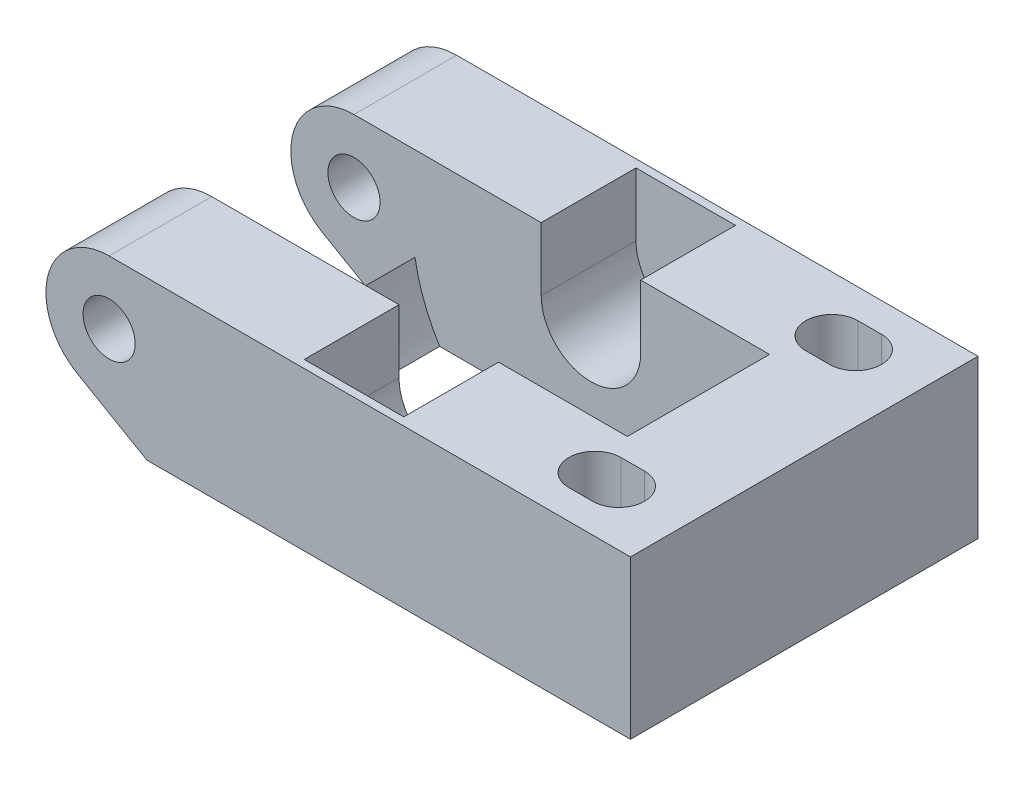
ISO-10303-21;
HEADER;
FILE_DESCRIPTION(('STEP AP214'),'2;1');
FILE_NAME('part.step','',(''),(''),'','','');
FILE_SCHEMA(('AUTOMOTIVE_DESIGN { 1 0 10303 214 1 1 1 1 }'));
ENDSEC;
DATA;
#1=APPLICATION_CONTEXT('core data for automotive mechanical design processes');
#2=APPLICATION_PROTOCOL_DEFINITION('international standard','automotive_design',2000,#1);
#3=PRODUCT_CONTEXT('',#1,'mechanical');
#4=PRODUCT('Part','Part','',(#3));
#5=PRODUCT_RELATED_PRODUCT_CATEGORY('part','',(#4));
#6=PRODUCT_DEFINITION_FORMATION('','',#4);
#7=PRODUCT_DEFINITION_CONTEXT('part definition',#1,'design');
#8=PRODUCT_DEFINITION('design','',#6,#7);
#9=PRODUCT_DEFINITION_SHAPE('','',#8);
#10=(LENGTH_UNIT() NAMED_UNIT(*) SI_UNIT(.MILLI.,.METRE.));
#11=(NAMED_UNIT(*) PLANE_ANGLE_UNIT() SI_UNIT($,.RADIAN.));
#12=(NAMED_UNIT(*) SI_UNIT($,.STERADIAN.) SOLID_ANGLE_UNIT());
#13=UNCERTAINTY_MEASURE_WITH_UNIT(LENGTH_MEASURE(1.E-05),#10,'distance_accuracy_value','');
#14=(GEOMETRIC_REPRESENTATION_CONTEXT(3) GLOBAL_UNCERTAINTY_ASSIGNED_CONTEXT((#13)) GLOBAL_UNIT_ASSIGNED_CONTEXT((#10,
#11,#12)) REPRESENTATION_CONTEXT('',''));
#15=CARTESIAN_POINT('',(0.,0.,0.));
#16=DIRECTION('',(0.,0.,1.));
#17=DIRECTION('',(1.,0.,0.));
#18=AXIS2_PLACEMENT_3D('',#15,#16,#17);
#19=CARTESIAN_POINT('',(-15.,4.,22.));
#20=DIRECTION('',(0.,-1.,0.));
#21=DIRECTION('',(0.,0.,-1.));
#22=AXIS2_PLACEMENT_3D('',#19,#20,#21);
#23=PLANE('',#22);
#24=DIRECTION('',(1.,0.,0.));
#25=VECTOR('',#24,1.);
#26=CARTESIAN_POINT('',(13.75,4.,1.85));
#27=LINE('',#26,#25);
#28=CARTESIAN_POINT('',(12.25,4.,1.85));
#29=VERTEX_POINT('',#28);
#30=CARTESIAN_POINT('',(13.75,4.,1.85));
#31=VERTEX_POINT('',#30);
#32=EDGE_CURVE('E236',#29,#31,#27,.T.);
#33=ORIENTED_EDGE('',*,*,#32,.T.);
#34=CARTESIAN_POINT('',(13.75,4.,3.5));
#35=DIRECTION('',(0.,-1.,0.));
#36=DIRECTION('',(0.,0.,1.));
#37=AXIS2_PLACEMENT_3D('',#34,#35,#36);
#38=CIRCLE('',#37,1.65);
#39=CARTESIAN_POINT('',(13.75,4.,5.15));
#40=VERTEX_POINT('',#39);
#41=EDGE_CURVE('E230',#31,#40,#38,.T.);
#42=ORIENTED_EDGE('',*,*,#41,.T.);
#43=DIRECTION('',(-1.,0.,0.));
#44=VECTOR('',#43,1.);
#45=CARTESIAN_POINT('',(13.75,4.,5.15));
#46=LINE('',#45,#44);
#47=CARTESIAN_POINT('',(12.25,4.,5.15));
#48=VERTEX_POINT('',#47);
#49=EDGE_CURVE('E239',#40,#48,#46,.T.);
#50=ORIENTED_EDGE('',*,*,#49,.T.);
#51=CARTESIAN_POINT('',(12.25,4.,3.5));
#52=DIRECTION('',(0.,-1.,0.));
#53=DIRECTION('',(0.,0.,1.));
#54=AXIS2_PLACEMENT_3D('',#51,#52,#53);
#55=CIRCLE('',#54,1.65);
#56=EDGE_CURVE('E46',#48,#29,#55,.T.);
#57=ORIENTED_EDGE('',*,*,#56,.T.);
#58=EDGE_LOOP('',(#33,#42,#50,#57));
#59=FACE_BOUND('',#58,.T.);
#60=DIRECTION('',(1.,0.,0.));
#61=VECTOR('',#60,1.);
#62=CARTESIAN_POINT('',(13.75,4.,16.85));
#63=LINE('',#62,#61);
#64=CARTESIAN_POINT('',(12.25,4.,16.85));
#65=VERTEX_POINT('',#64);
#66=CARTESIAN_POINT('',(13.75,4.,16.85));
#67=VERTEX_POINT('',#66);
#68=EDGE_CURVE('E274',#65,#67,#63,.T.);
#69=ORIENTED_EDGE('',*,*,#68,.T.);
#70=CARTESIAN_POINT('',(13.75,4.,18.5));
#71=DIRECTION('',(0.,-1.,0.));
#72=DIRECTION('',(0.,0.,-1.));
#73=AXIS2_PLACEMENT_3D('',#70,#71,#72);
#74=CIRCLE('',#73,1.65);
#75=CARTESIAN_POINT('',(13.75,4.,20.15));
#76=VERTEX_POINT('',#75);
#77=EDGE_CURVE('E264',#67,#76,#74,.T.);
#78=ORIENTED_EDGE('',*,*,#77,.T.);
#79=DIRECTION('',(-1.,0.,0.));
#80=VECTOR('',#79,1.);
#81=CARTESIAN_POINT('',(13.75,4.,20.15));
#82=LINE('',#81,#80);
#83=CARTESIAN_POINT('',(12.25,4.,20.15));
#84=VERTEX_POINT('',#83);
#85=EDGE_CURVE('E267',#76,#84,#82,.T.);
#86=ORIENTED_EDGE('',*,*,#85,.T.);
#87=CARTESIAN_POINT('',(12.25,4.,18.5));
#88=DIRECTION('',(0.,-1.,0.));
#89=DIRECTION('',(0.,0.,-1.));
#90=AXIS2_PLACEMENT_3D('',#87,#88,#89);
#91=CIRCLE('',#90,1.65);
#92=EDGE_CURVE('E271',#84,#65,#91,.T.);
#93=ORIENTED_EDGE('',*,*,#92,.T.);
#94=EDGE_LOOP('',(#69,#78,#86,#93));
#95=FACE_BOUND('',#94,.T.);
#96=DIRECTION('',(0.,0.,-1.));
#97=VECTOR('',#96,1.);
#98=CARTESIAN_POINT('',(3.15,4.,22.));
#99=LINE('',#98,#97);
#100=CARTESIAN_POINT('',(3.15,4.,21.5));
#101=VERTEX_POINT('',#100);
#102=CARTESIAN_POINT('',(3.15,4.,15.5));
#103=VERTEX_POINT('',#102);
#104=EDGE_CURVE('E327',#101,#103,#99,.T.);
#105=ORIENTED_EDGE('',*,*,#104,.F.);
#106=DIRECTION('',(-1.,0.,0.));
#107=VECTOR('',#106,1.);
#108=CARTESIAN_POINT('',(-15.,4.,21.5));
#109=LINE('',#108,#107);
#110=CARTESIAN_POINT('',(-3.15,4.,21.5));
#111=VERTEX_POINT('',#110);
#112=EDGE_CURVE('E11',#101,#111,#109,.T.);
#113=ORIENTED_EDGE('',*,*,#112,.T.);
#114=DIRECTION('',(0.,0.,1.));
#115=VECTOR('',#114,1.);
#116=CARTESIAN_POINT('',(-3.15,4.,22.));
#117=LINE('',#116,#115);
#118=CARTESIAN_POINT('',(-3.15,4.,15.5));
#119=VERTEX_POINT('',#118);
#120=EDGE_CURVE('E322',#119,#111,#117,.T.);
#121=ORIENTED_EDGE('',*,*,#120,.F.);
#122=DIRECTION('',(-1.,0.,0.));
#123=VECTOR('',#122,1.);
#124=CARTESIAN_POINT('',(-15.,4.,15.5));
#125=LINE('',#124,#123);
#126=CARTESIAN_POINT('',(-15.,4.,15.5));
#127=VERTEX_POINT('',#126);
#128=EDGE_CURVE('E384',#119,#127,#125,.T.);
#129=ORIENTED_EDGE('',*,*,#128,.T.);
#130=DIRECTION('',(0.,0.,-1.));
#131=VECTOR('',#130,1.);
#132=CARTESIAN_POINT('',(-15.,4.,22.));
#133=LINE('',#132,#131);
#134=CARTESIAN_POINT('',(-15.,4.,22.));
#135=VERTEX_POINT('',#134);
#136=EDGE_CURVE('E429',#135,#127,#133,.T.);
#137=ORIENTED_EDGE('',*,*,#136,.F.);
#138=DIRECTION('',(-1.,0.,0.));
#139=VECTOR('',#138,1.);
#140=CARTESIAN_POINT('',(-15.,4.,22.));
#141=LINE('',#140,#139);
#142=CARTESIAN_POINT('',(18.,4.,22.));
#143=VERTEX_POINT('',#142);
#144=EDGE_CURVE('E398',#143,#135,#141,.T.);
#145=ORIENTED_EDGE('',*,*,#144,.F.);
#146=DIRECTION('',(0.,0.,-1.));
#147=VECTOR('',#146,1.);
#148=CARTESIAN_POINT('',(18.,4.,22.));
#149=LINE('',#148,#147);
#150=CARTESIAN_POINT('',(18.,4.,0.));
#151=VERTEX_POINT('',#150);
#152=EDGE_CURVE('E432',#143,#151,#149,.T.);
#153=ORIENTED_EDGE('',*,*,#152,.T.);
#154=DIRECTION('',(-1.,0.,0.));
#155=VECTOR('',#154,1.);
#156=CARTESIAN_POINT('',(-15.,4.,0.));
#157=LINE('',#156,#155);
#158=CARTESIAN_POINT('',(-15.,4.,0.));
#159=VERTEX_POINT('',#158);
#160=EDGE_CURVE('E410',#151,#159,#157,.T.);
#161=ORIENTED_EDGE('',*,*,#160,.T.);
#162=CARTESIAN_POINT('',(-15.,4.,6.5));
#163=VERTEX_POINT('',#162);
#164=EDGE_CURVE('E428',#163,#159,#133,.T.);
#165=ORIENTED_EDGE('',*,*,#164,.F.);
#166=DIRECTION('',(-1.,0.,0.));
#167=VECTOR('',#166,1.);
#168=CARTESIAN_POINT('',(-15.,4.,6.5));
#169=LINE('',#168,#167);
#170=CARTESIAN_POINT('',(-3.15,4.,6.5));
#171=VERTEX_POINT('',#170);
#172=EDGE_CURVE('E370',#171,#163,#169,.T.);
#173=ORIENTED_EDGE('',*,*,#172,.F.);
#174=CARTESIAN_POINT('',(-3.15,4.,0.499999999999999));
#175=VERTEX_POINT('',#174);
#176=EDGE_CURVE('E319',#175,#171,#117,.T.);
#177=ORIENTED_EDGE('',*,*,#176,.F.);
#178=DIRECTION('',(-1.,0.,0.));
#179=VECTOR('',#178,1.);
#180=CARTESIAN_POINT('',(-15.,4.,0.5));
#181=LINE('',#180,#179);
#182=CARTESIAN_POINT('',(3.15,4.,0.499999999999999));
#183=VERTEX_POINT('',#182);
#184=EDGE_CURVE('E39',#183,#175,#181,.T.);
#185=ORIENTED_EDGE('',*,*,#184,.F.);
#186=CARTESIAN_POINT('',(3.15,4.,6.5));
#187=VERTEX_POINT('',#186);
#188=EDGE_CURVE('E324',#187,#183,#99,.T.);
#189=ORIENTED_EDGE('',*,*,#188,.F.);
#190=CARTESIAN_POINT('',(11.3,4.,6.5));
#191=VERTEX_POINT('',#190);
#192=EDGE_CURVE('E371',#191,#187,#169,.T.);
#193=ORIENTED_EDGE('',*,*,#192,.F.);
#194=DIRECTION('',(0.,0.,-1.));
#195=VECTOR('',#194,1.);
#196=CARTESIAN_POINT('',(11.3,4.,22.));
#197=LINE('',#196,#195);
#198=CARTESIAN_POINT('',(11.3,4.,15.5));
#199=VERTEX_POINT('',#198);
#200=EDGE_CURVE('E446',#199,#191,#197,.T.);
#201=ORIENTED_EDGE('',*,*,#200,.F.);
#202=EDGE_CURVE('E385',#199,#103,#125,.T.);
#203=ORIENTED_EDGE('',*,*,#202,.T.);
#204=EDGE_LOOP('',(#105,#113,#121,#129,#137,#145,#153,#161,#165,#173,#177,#185,#189,#193,#201,#203));
#205=FACE_BOUND('',#204,.T.);
#206=ADVANCED_FACE('F31',(#59,#95,#205),#23,.F.);
#207=CARTESIAN_POINT('',(-15.,0.,15.5));
#208=DIRECTION('',(0.,0.,1.));
#209=DIRECTION('',(1.,0.,0.));
#210=AXIS2_PLACEMENT_3D('',#207,#208,#209);
#211=PLANE('',#210);
#212=CARTESIAN_POINT('',(-15.,0.,15.5));
#213=DIRECTION('',(0.,0.,1.));
#214=DIRECTION('',(1.,0.,0.));
#215=AXIS2_PLACEMENT_3D('',#212,#213,#214);
#216=CIRCLE('',#215,1.65);
#217=CARTESIAN_POINT('',(-13.35,0.,15.5));
#218=VERTEX_POINT('',#217);
#219=EDGE_CURVE('E374',#218,#218,#216,.T.);
#220=ORIENTED_EDGE('',*,*,#219,.T.);
#221=EDGE_LOOP('',(#220));
#222=FACE_BOUND('',#221,.T.);
#223=DIRECTION('',(0.,-1.,0.));
#224=VECTOR('',#223,1.);
#225=CARTESIAN_POINT('',(3.15,0.,15.5));
#226=LINE('',#225,#224);
#227=CARTESIAN_POINT('',(3.15,0.,15.5));
#228=VERTEX_POINT('',#227);
#229=EDGE_CURVE('E326',#103,#228,#226,.T.);
#230=ORIENTED_EDGE('',*,*,#229,.F.);
#231=ORIENTED_EDGE('',*,*,#202,.F.);
#232=DIRECTION('',(0.,1.,0.));
#233=VECTOR('',#232,1.);
#234=CARTESIAN_POINT('',(11.3,11.3,15.5));
#235=LINE('',#234,#233);
#236=CARTESIAN_POINT('',(11.3,0.,15.5));
#237=VERTEX_POINT('',#236);
#238=EDGE_CURVE('E350',#237,#199,#235,.T.);
#239=ORIENTED_EDGE('',*,*,#238,.F.);
#240=CARTESIAN_POINT('',(0.,0.,15.5));
#241=DIRECTION('',(0.,0.,1.));
#242=DIRECTION('',(1.,0.,0.));
#243=AXIS2_PLACEMENT_3D('',#240,#241,#242);
#244=CIRCLE('',#243,11.3);
#245=CARTESIAN_POINT('',(9.57548954362126,-6.,15.5));
#246=VERTEX_POINT('',#245);
#247=EDGE_CURVE('E346',#246,#237,#244,.T.);
#248=ORIENTED_EDGE('',*,*,#247,.F.);
#249=DIRECTION('',(1.,0.,0.));
#250=VECTOR('',#249,1.);
#251=CARTESIAN_POINT('',(-12.6076951545868,-6.,15.5));
#252=LINE('',#251,#250);
#253=CARTESIAN_POINT('',(-9.57548954362126,-6.,15.5));
#254=VERTEX_POINT('',#253);
#255=EDGE_CURVE('E375',#254,#246,#252,.T.);
#256=ORIENTED_EDGE('',*,*,#255,.F.);
#257=CARTESIAN_POINT('',(-11.14,-1.89483508517232,15.5));
#258=VERTEX_POINT('',#257);
#259=EDGE_CURVE('E347',#258,#254,#244,.T.);
#260=ORIENTED_EDGE('',*,*,#259,.F.);
#261=CARTESIAN_POINT('',(-15.,0.,15.5));
#262=DIRECTION('',(0.,0.,1.));
#263=DIRECTION('',(1.,0.,0.));
#264=AXIS2_PLACEMENT_3D('',#261,#262,#263);
#265=CIRCLE('',#264,4.3);
#266=CARTESIAN_POINT('',(-11.7060088945884,-2.7639867216521,15.5));
#267=VERTEX_POINT('',#266);
#268=EDGE_CURVE('E343',#267,#258,#265,.T.);
#269=ORIENTED_EDGE('',*,*,#268,.F.);
#270=DIRECTION('',(0.642787609686535,0.766044443118982,0.));
#271=VECTOR('',#270,1.);
#272=CARTESIAN_POINT('',(-11.7060088945884,-2.7639867216521,15.5));
#273=LINE('',#272,#271);
#274=CARTESIAN_POINT('',(-13.8294580399057,-5.29461486927519,15.5));
#275=VERTEX_POINT('',#274);
#276=EDGE_CURVE('E353',#275,#267,#273,.T.);
#277=ORIENTED_EDGE('',*,*,#276,.F.);
#278=DIRECTION('',(0.866025403784438,-0.500000000000002,0.));
#279=VECTOR('',#278,1.);
#280=CARTESIAN_POINT('',(-17.,-3.46410161513775,15.5));
#281=LINE('',#280,#279);
#282=CARTESIAN_POINT('',(-17.,-3.46410161513775,15.5));
#283=VERTEX_POINT('',#282);
#284=EDGE_CURVE('E378',#283,#275,#281,.T.);
#285=ORIENTED_EDGE('',*,*,#284,.F.);
#286=CARTESIAN_POINT('',(-15.,0.,15.5));
#287=DIRECTION('',(0.,0.,1.));
#288=DIRECTION('',(1.,0.,0.));
#289=AXIS2_PLACEMENT_3D('',#286,#287,#288);
#290=CIRCLE('',#289,4.);
#291=EDGE_CURVE('E381',#127,#283,#290,.T.);
#292=ORIENTED_EDGE('',*,*,#291,.F.);
#293=ORIENTED_EDGE('',*,*,#128,.F.);
#294=DIRECTION('',(0.,1.,0.));
#295=VECTOR('',#294,1.);
#296=CARTESIAN_POINT('',(-3.15,0.,15.5));
#297=LINE('',#296,#295);
#298=CARTESIAN_POINT('',(-3.15,0.,15.5));
#299=VERTEX_POINT('',#298);
#300=EDGE_CURVE('E321',#299,#119,#297,.T.);
#301=ORIENTED_EDGE('',*,*,#300,.F.);
#302=CARTESIAN_POINT('',(0.,0.,15.5));
#303=DIRECTION('',(0.,0.,1.));
#304=DIRECTION('',(1.,0.,0.));
#305=AXIS2_PLACEMENT_3D('',#302,#303,#304);
#306=CIRCLE('',#305,3.15);
#307=EDGE_CURVE('E329',#228,#299,#306,.F.);
#308=ORIENTED_EDGE('',*,*,#307,.F.);
#309=EDGE_LOOP('',(#230,#231,#239,#248,#256,#260,#269,#277,#285,#292,#293,#301,#308));
#310=FACE_BOUND('',#309,.T.);
#311=ADVANCED_FACE('F511',(#222,#310),#211,.F.);
#312=CARTESIAN_POINT('',(-15.,0.,6.5));
#313=DIRECTION('',(0.,0.,1.));
#314=DIRECTION('',(1.,0.,0.));
#315=AXIS2_PLACEMENT_3D('',#312,#313,#314);
#316=PLANE('',#315);
#317=CARTESIAN_POINT('',(-15.,0.,6.5));
#318=DIRECTION('',(0.,0.,1.));
#319=DIRECTION('',(1.,0.,0.));
#320=AXIS2_PLACEMENT_3D('',#317,#318,#319);
#321=CIRCLE('',#320,1.65);
#322=CARTESIAN_POINT('',(-13.35,0.,6.5));
#323=VERTEX_POINT('',#322);
#324=EDGE_CURVE('E363',#323,#323,#321,.T.);
#325=ORIENTED_EDGE('',*,*,#324,.F.);
#326=EDGE_LOOP('',(#325));
#327=FACE_BOUND('',#326,.T.);
#328=ORIENTED_EDGE('',*,*,#192,.T.);
#329=DIRECTION('',(0.,-1.,0.));
#330=VECTOR('',#329,1.);
#331=CARTESIAN_POINT('',(3.15,0.,6.5));
#332=LINE('',#331,#330);
#333=CARTESIAN_POINT('',(3.15,0.,6.5));
#334=VERTEX_POINT('',#333);
#335=EDGE_CURVE('E454',#187,#334,#332,.T.);
#336=ORIENTED_EDGE('',*,*,#335,.T.);
#337=CARTESIAN_POINT('',(0.,0.,6.5));
#338=DIRECTION('',(0.,0.,1.));
#339=DIRECTION('',(1.,0.,0.));
#340=AXIS2_PLACEMENT_3D('',#337,#338,#339);
#341=CIRCLE('',#340,3.15);
#342=CARTESIAN_POINT('',(-3.15,0.,6.5));
#343=VERTEX_POINT('',#342);
#344=EDGE_CURVE('E451',#334,#343,#341,.F.);
#345=ORIENTED_EDGE('',*,*,#344,.T.);
#346=DIRECTION('',(0.,1.,0.));
#347=VECTOR('',#346,1.);
#348=CARTESIAN_POINT('',(-3.15,0.,6.5));
#349=LINE('',#348,#347);
#350=EDGE_CURVE('E448',#343,#171,#349,.T.);
#351=ORIENTED_EDGE('',*,*,#350,.T.);
#352=ORIENTED_EDGE('',*,*,#172,.T.);
#353=CARTESIAN_POINT('',(-15.,0.,6.5));
#354=DIRECTION('',(0.,0.,1.));
#355=DIRECTION('',(1.,0.,0.));
#356=AXIS2_PLACEMENT_3D('',#353,#354,#355);
#357=CIRCLE('',#356,4.);
#358=CARTESIAN_POINT('',(-17.,-3.46410161513775,6.5));
#359=VERTEX_POINT('',#358);
#360=EDGE_CURVE('E368',#163,#359,#357,.T.);
#361=ORIENTED_EDGE('',*,*,#360,.T.);
#362=DIRECTION('',(0.866025403784438,-0.500000000000002,0.));
#363=VECTOR('',#362,1.);
#364=CARTESIAN_POINT('',(-17.,-3.46410161513775,6.5));
#365=LINE('',#364,#363);
#366=CARTESIAN_POINT('',(-13.8294580399057,-5.29461486927519,6.5));
#367=VERTEX_POINT('',#366);
#368=EDGE_CURVE('E366',#359,#367,#365,.T.);
#369=ORIENTED_EDGE('',*,*,#368,.T.);
#370=DIRECTION('',(0.642787609686535,0.766044443118982,0.));
#371=VECTOR('',#370,1.);
#372=CARTESIAN_POINT('',(-11.7060088945884,-2.7639867216521,6.5));
#373=LINE('',#372,#371);
#374=CARTESIAN_POINT('',(-11.7060088945884,-2.7639867216521,6.5));
#375=VERTEX_POINT('',#374);
#376=EDGE_CURVE('E341',#367,#375,#373,.T.);
#377=ORIENTED_EDGE('',*,*,#376,.T.);
#378=CARTESIAN_POINT('',(-15.,0.,6.5));
#379=DIRECTION('',(0.,0.,1.));
#380=DIRECTION('',(1.,0.,0.));
#381=AXIS2_PLACEMENT_3D('',#378,#379,#380);
#382=CIRCLE('',#381,4.3);
#383=CARTESIAN_POINT('',(-11.14,-1.89483508517232,6.5));
#384=VERTEX_POINT('',#383);
#385=EDGE_CURVE('E332',#375,#384,#382,.T.);
#386=ORIENTED_EDGE('',*,*,#385,.T.);
#387=CARTESIAN_POINT('',(0.,0.,6.5));
#388=DIRECTION('',(0.,0.,1.));
#389=DIRECTION('',(1.,0.,0.));
#390=AXIS2_PLACEMENT_3D('',#387,#388,#389);
#391=CIRCLE('',#390,11.3);
#392=CARTESIAN_POINT('',(-9.57548954362126,-6.,6.5));
#393=VERTEX_POINT('',#392);
#394=EDGE_CURVE('E336',#384,#393,#391,.T.);
#395=ORIENTED_EDGE('',*,*,#394,.T.);
#396=DIRECTION('',(1.,0.,0.));
#397=VECTOR('',#396,1.);
#398=CARTESIAN_POINT('',(-12.6076951545868,-6.,6.5));
#399=LINE('',#398,#397);
#400=CARTESIAN_POINT('',(9.57548954362126,-6.,6.5));
#401=VERTEX_POINT('',#400);
#402=EDGE_CURVE('E364',#393,#401,#399,.T.);
#403=ORIENTED_EDGE('',*,*,#402,.T.);
#404=CARTESIAN_POINT('',(11.3,0.,6.5));
#405=VERTEX_POINT('',#404);
#406=EDGE_CURVE('E335',#401,#405,#391,.T.);
#407=ORIENTED_EDGE('',*,*,#406,.T.);
#408=DIRECTION('',(0.,1.,0.));
#409=VECTOR('',#408,1.);
#410=CARTESIAN_POINT('',(11.3,11.3,6.5));
#411=LINE('',#410,#409);
#412=EDGE_CURVE('E338',#405,#191,#411,.T.);
#413=ORIENTED_EDGE('',*,*,#412,.T.);
#414=EDGE_LOOP('',(#328,#336,#345,#351,#352,#361,#369,#377,#386,#395,#403,#407,#413));
#415=FACE_BOUND('',#414,.T.);
#416=ADVANCED_FACE('F473',(#327,#415),#316,.T.);
#417=CARTESIAN_POINT('',(-15.,0.,22.));
#418=DIRECTION('',(0.,0.,-1.));
#419=DIRECTION('',(-1.,0.,0.));
#420=AXIS2_PLACEMENT_3D('',#417,#418,#419);
#421=CYLINDRICAL_SURFACE('',#420,4.);
#422=ORIENTED_EDGE('',*,*,#360,.F.);
#423=ORIENTED_EDGE('',*,*,#164,.T.);
#424=CARTESIAN_POINT('',(-15.,0.,0.));
#425=DIRECTION('',(0.,0.,1.));
#426=DIRECTION('',(1.,0.,0.));
#427=AXIS2_PLACEMENT_3D('',#424,#425,#426);
#428=CIRCLE('',#427,4.);
#429=CARTESIAN_POINT('',(-17.,-3.46410161513775,0.));
#430=VERTEX_POINT('',#429);
#431=EDGE_CURVE('E413',#159,#430,#428,.T.);
#432=ORIENTED_EDGE('',*,*,#431,.T.);
#433=DIRECTION('',(0.,0.,-1.));
#434=VECTOR('',#433,1.);
#435=CARTESIAN_POINT('',(-17.,-3.46410161513775,22.));
#436=LINE('',#435,#434);
#437=EDGE_CURVE('E424',#359,#430,#436,.T.);
#438=ORIENTED_EDGE('',*,*,#437,.F.);
#439=EDGE_LOOP('',(#422,#423,#432,#438));
#440=FACE_BOUND('',#439,.T.);
#441=ADVANCED_FACE('F477',(#440),#421,.T.);
#442=CARTESIAN_POINT('',(-15.,0.,22.));
#443=DIRECTION('',(0.,0.,-1.));
#444=DIRECTION('',(-1.,0.,0.));
#445=AXIS2_PLACEMENT_3D('',#442,#443,#444);
#446=CYLINDRICAL_SURFACE('',#445,1.65);
#447=CARTESIAN_POINT('',(-15.,0.,0.));
#448=DIRECTION('',(0.,0.,1.));
#449=DIRECTION('',(1.,0.,0.));
#450=AXIS2_PLACEMENT_3D('',#447,#448,#449);
#451=CIRCLE('',#450,1.65);
#452=CARTESIAN_POINT('',(-13.35,0.,0.));
#453=VERTEX_POINT('',#452);
#454=EDGE_CURVE('E388',#453,#453,#451,.T.);
#455=ORIENTED_EDGE('',*,*,#454,.F.);
#456=EDGE_LOOP('',(#455));
#457=FACE_BOUND('',#456,.T.);
#458=ORIENTED_EDGE('',*,*,#324,.T.);
#459=EDGE_LOOP('',(#458));
#460=FACE_BOUND('',#459,.T.);
#461=ADVANCED_FACE('F560',(#457,#460),#446,.F.);
#462=CARTESIAN_POINT('',(-15.,0.,22.));
#463=DIRECTION('',(0.,0.,1.));
#464=DIRECTION('',(1.,0.,0.));
#465=AXIS2_PLACEMENT_3D('',#462,#463,#464);
#466=PLANE('',#465);
#467=DIRECTION('',(0.,1.,0.));
#468=VECTOR('',#467,1.);
#469=CARTESIAN_POINT('',(18.,-6.,22.));
#470=LINE('',#469,#468);
#471=CARTESIAN_POINT('',(18.,-6.,22.));
#472=VERTEX_POINT('',#471);
#473=EDGE_CURVE('E395',#472,#143,#470,.T.);
#474=ORIENTED_EDGE('',*,*,#473,.T.);
#475=ORIENTED_EDGE('',*,*,#144,.T.);
#476=CARTESIAN_POINT('',(-15.,0.,22.));
#477=DIRECTION('',(0.,0.,1.));
#478=DIRECTION('',(1.,0.,0.));
#479=AXIS2_PLACEMENT_3D('',#476,#477,#478);
#480=CIRCLE('',#479,4.);
#481=CARTESIAN_POINT('',(-17.,-3.46410161513775,22.));
#482=VERTEX_POINT('',#481);
#483=EDGE_CURVE('E401',#135,#482,#480,.T.);
#484=ORIENTED_EDGE('',*,*,#483,.T.);
#485=DIRECTION('',(0.866025403784438,-0.500000000000002,0.));
#486=VECTOR('',#485,1.);
#487=CARTESIAN_POINT('',(-17.,-3.46410161513775,22.));
#488=LINE('',#487,#486);
#489=CARTESIAN_POINT('',(-12.6076951545868,-6.,22.));
#490=VERTEX_POINT('',#489);
#491=EDGE_CURVE('E403',#482,#490,#488,.T.);
#492=ORIENTED_EDGE('',*,*,#491,.T.);
#493=DIRECTION('',(1.,0.,0.));
#494=VECTOR('',#493,1.);
#495=CARTESIAN_POINT('',(-12.6076951545868,-6.,22.));
#496=LINE('',#495,#494);
#497=EDGE_CURVE('E405',#490,#472,#496,.T.);
#498=ORIENTED_EDGE('',*,*,#497,.T.);
#499=EDGE_LOOP('',(#474,#475,#484,#492,#498));
#500=FACE_BOUND('',#499,.T.);
#501=CARTESIAN_POINT('',(-15.,0.,22.));
#502=DIRECTION('',(0.,0.,1.));
#503=DIRECTION('',(1.,0.,0.));
#504=AXIS2_PLACEMENT_3D('',#501,#502,#503);
#505=CIRCLE('',#504,1.65);
#506=CARTESIAN_POINT('',(-13.35,0.,22.));
#507=VERTEX_POINT('',#506);
#508=EDGE_CURVE('E389',#507,#507,#505,.T.);
#509=ORIENTED_EDGE('',*,*,#508,.F.);
#510=EDGE_LOOP('',(#509));
#511=FACE_BOUND('',#510,.T.);
#512=ADVANCED_FACE('F556',(#500,#511),#466,.T.);
#513=CARTESIAN_POINT('',(-15.,0.,0.));
#514=DIRECTION('',(0.,0.,1.));
#515=DIRECTION('',(1.,0.,0.));
#516=AXIS2_PLACEMENT_3D('',#513,#514,#515);
#517=PLANE('',#516);
#518=DIRECTION('',(0.,1.,0.));
#519=VECTOR('',#518,1.);
#520=CARTESIAN_POINT('',(18.,-6.,0.));
#521=LINE('',#520,#519);
#522=CARTESIAN_POINT('',(18.,-6.,0.));
#523=VERTEX_POINT('',#522);
#524=EDGE_CURVE('E392',#523,#151,#521,.T.);
#525=ORIENTED_EDGE('',*,*,#524,.F.);
#526=DIRECTION('',(1.,0.,0.));
#527=VECTOR('',#526,1.);
#528=CARTESIAN_POINT('',(-12.6076951545868,-6.,0.));
#529=LINE('',#528,#527);
#530=CARTESIAN_POINT('',(-12.6076951545868,-6.,0.));
#531=VERTEX_POINT('',#530);
#532=EDGE_CURVE('E399',#531,#523,#529,.T.);
#533=ORIENTED_EDGE('',*,*,#532,.F.);
#534=DIRECTION('',(0.866025403784438,-0.500000000000002,0.));
#535=VECTOR('',#534,1.);
#536=CARTESIAN_POINT('',(-17.,-3.46410161513775,0.));
#537=LINE('',#536,#535);
#538=EDGE_CURVE('E416',#430,#531,#537,.T.);
#539=ORIENTED_EDGE('',*,*,#538,.F.);
#540=ORIENTED_EDGE('',*,*,#431,.F.);
#541=ORIENTED_EDGE('',*,*,#160,.F.);
#542=EDGE_LOOP('',(#525,#533,#539,#540,#541));
#543=FACE_BOUND('',#542,.T.);
#544=ORIENTED_EDGE('',*,*,#454,.T.);
#545=EDGE_LOOP('',(#544));
#546=FACE_BOUND('',#545,.T.);
#547=ADVANCED_FACE('F553',(#543,#546),#517,.F.);
#548=CARTESIAN_POINT('',(18.,-6.,22.));
#549=DIRECTION('',(-1.,0.,0.));
#550=DIRECTION('',(0.,0.,1.));
#551=AXIS2_PLACEMENT_3D('',#548,#549,#550);
#552=PLANE('',#551);
#553=ORIENTED_EDGE('',*,*,#524,.T.);
#554=ORIENTED_EDGE('',*,*,#152,.F.);
#555=ORIENTED_EDGE('',*,*,#473,.F.);
#556=DIRECTION('',(0.,0.,-1.));
#557=VECTOR('',#556,1.);
#558=CARTESIAN_POINT('',(18.,-6.,22.));
#559=LINE('',#558,#557);
#560=EDGE_CURVE('E407',#472,#523,#559,.T.);
#561=ORIENTED_EDGE('',*,*,#560,.T.);
#562=EDGE_LOOP('',(#553,#554,#555,#561));
#563=FACE_BOUND('',#562,.T.);
#564=ADVANCED_FACE('F33',(#563),#552,.F.);
#565=ORIENTED_EDGE('',*,*,#136,.T.);
#566=ORIENTED_EDGE('',*,*,#291,.T.);
#567=EDGE_CURVE('E425',#482,#283,#436,.T.);
#568=ORIENTED_EDGE('',*,*,#567,.F.);
#569=ORIENTED_EDGE('',*,*,#483,.F.);
#570=EDGE_LOOP('',(#565,#566,#568,#569));
#571=FACE_BOUND('',#570,.T.);
#572=ADVANCED_FACE('F543',(#571),#421,.T.);
#573=CARTESIAN_POINT('',(-17.,-3.46410161513775,22.));
#574=DIRECTION('',(0.500000000000002,0.866025403784438,0.));
#575=DIRECTION('',(-0.866025403784438,0.500000000000002,0.));
#576=AXIS2_PLACEMENT_3D('',#573,#574,#575);
#577=PLANE('',#576);
#578=ORIENTED_EDGE('',*,*,#567,.T.);
#579=ORIENTED_EDGE('',*,*,#284,.T.);
#580=DIRECTION('',(0.,0.,1.));
#581=VECTOR('',#580,1.);
#582=CARTESIAN_POINT('',(-13.8294580399057,-5.29461486927519,22.));
#583=LINE('',#582,#581);
#584=EDGE_CURVE('E444',#367,#275,#583,.T.);
#585=ORIENTED_EDGE('',*,*,#584,.F.);
#586=ORIENTED_EDGE('',*,*,#368,.F.);
#587=ORIENTED_EDGE('',*,*,#437,.T.);
#588=ORIENTED_EDGE('',*,*,#538,.T.);
#589=DIRECTION('',(0.,0.,-1.));
#590=VECTOR('',#589,1.);
#591=CARTESIAN_POINT('',(-12.6076951545868,-6.,22.));
#592=LINE('',#591,#590);
#593=EDGE_CURVE('E421',#490,#531,#592,.T.);
#594=ORIENTED_EDGE('',*,*,#593,.F.);
#595=ORIENTED_EDGE('',*,*,#491,.F.);
#596=EDGE_LOOP('',(#578,#579,#585,#586,#587,#588,#594,#595));
#597=FACE_BOUND('',#596,.T.);
#598=ADVANCED_FACE('F481',(#597),#577,.F.);
#599=CARTESIAN_POINT('',(-12.6076951545868,-6.,22.));
#600=DIRECTION('',(0.,1.,0.));
#601=DIRECTION('',(0.,0.,1.));
#602=AXIS2_PLACEMENT_3D('',#599,#600,#601);
#603=PLANE('',#602);
#604=DIRECTION('',(-1.,0.,0.));
#605=VECTOR('',#604,1.);
#606=CARTESIAN_POINT('',(13.75,-6.,5.15));
#607=LINE('',#606,#605);
#608=CARTESIAN_POINT('',(13.75,-6.,5.15));
#609=VERTEX_POINT('',#608);
#610=CARTESIAN_POINT('',(12.25,-6.,5.15));
#611=VERTEX_POINT('',#610);
#612=EDGE_CURVE('E254',#609,#611,#607,.T.);
#613=ORIENTED_EDGE('',*,*,#612,.F.);
#614=CARTESIAN_POINT('',(13.75,-6.,3.5));
#615=DIRECTION('',(0.,-1.,0.));
#616=DIRECTION('',(0.,0.,1.));
#617=AXIS2_PLACEMENT_3D('',#614,#615,#616);
#618=CIRCLE('',#617,1.65);
#619=CARTESIAN_POINT('',(13.75,-6.,1.85));
#620=VERTEX_POINT('',#619);
#621=EDGE_CURVE('E54',#620,#609,#618,.T.);
#622=ORIENTED_EDGE('',*,*,#621,.F.);
#623=DIRECTION('',(1.,0.,0.));
#624=VECTOR('',#623,1.);
#625=CARTESIAN_POINT('',(13.75,-6.,1.85));
#626=LINE('',#625,#624);
#627=CARTESIAN_POINT('',(12.25,-6.,1.85));
#628=VERTEX_POINT('',#627);
#629=EDGE_CURVE('E245',#628,#620,#626,.T.);
#630=ORIENTED_EDGE('',*,*,#629,.F.);
#631=CARTESIAN_POINT('',(12.25,-6.,3.5));
#632=DIRECTION('',(0.,-1.,0.));
#633=DIRECTION('',(0.,0.,1.));
#634=AXIS2_PLACEMENT_3D('',#631,#632,#633);
#635=CIRCLE('',#634,1.65);
#636=EDGE_CURVE('E248',#611,#628,#635,.T.);
#637=ORIENTED_EDGE('',*,*,#636,.F.);
#638=EDGE_LOOP('',(#613,#622,#630,#637));
#639=FACE_BOUND('',#638,.T.);
#640=DIRECTION('',(-1.,0.,0.));
#641=VECTOR('',#640,1.);
#642=CARTESIAN_POINT('',(13.75,-6.,20.15));
#643=LINE('',#642,#641);
#644=CARTESIAN_POINT('',(13.75,-6.,20.15));
#645=VERTEX_POINT('',#644);
#646=CARTESIAN_POINT('',(12.25,-6.,20.15));
#647=VERTEX_POINT('',#646);
#648=EDGE_CURVE('E279',#645,#647,#643,.T.);
#649=ORIENTED_EDGE('',*,*,#648,.F.);
#650=CARTESIAN_POINT('',(13.75,-6.,18.5));
#651=DIRECTION('',(0.,-1.,0.));
#652=DIRECTION('',(0.,0.,-1.));
#653=AXIS2_PLACEMENT_3D('',#650,#651,#652);
#654=CIRCLE('',#653,1.65);
#655=CARTESIAN_POINT('',(13.75,-6.,16.85));
#656=VERTEX_POINT('',#655);
#657=EDGE_CURVE('E260',#656,#645,#654,.T.);
#658=ORIENTED_EDGE('',*,*,#657,.F.);
#659=DIRECTION('',(1.,0.,0.));
#660=VECTOR('',#659,1.);
#661=CARTESIAN_POINT('',(13.75,-6.,16.85));
#662=LINE('',#661,#660);
#663=CARTESIAN_POINT('',(12.25,-6.,16.85));
#664=VERTEX_POINT('',#663);
#665=EDGE_CURVE('E268',#664,#656,#662,.T.);
#666=ORIENTED_EDGE('',*,*,#665,.F.);
#667=CARTESIAN_POINT('',(12.25,-6.,18.5));
#668=DIRECTION('',(0.,-1.,0.));
#669=DIRECTION('',(0.,0.,-1.));
#670=AXIS2_PLACEMENT_3D('',#667,#668,#669);
#671=CIRCLE('',#670,1.65);
#672=EDGE_CURVE('E282',#647,#664,#671,.T.);
#673=ORIENTED_EDGE('',*,*,#672,.F.);
#674=EDGE_LOOP('',(#649,#658,#666,#673));
#675=FACE_BOUND('',#674,.T.);
#676=DIRECTION('',(0.,0.,-1.));
#677=VECTOR('',#676,1.);
#678=CARTESIAN_POINT('',(-9.57548954362126,-6.,15.5));
#679=LINE('',#678,#677);
#680=EDGE_CURVE('E435',#254,#393,#679,.T.);
#681=ORIENTED_EDGE('',*,*,#680,.F.);
#682=ORIENTED_EDGE('',*,*,#255,.T.);
#683=DIRECTION('',(0.,0.,-1.));
#684=VECTOR('',#683,1.);
#685=CARTESIAN_POINT('',(9.57548954362126,-6.,15.5));
#686=LINE('',#685,#684);
#687=EDGE_CURVE('E442',#401,#246,#686,.F.);
#688=ORIENTED_EDGE('',*,*,#687,.F.);
#689=ORIENTED_EDGE('',*,*,#402,.F.);
#690=EDGE_LOOP('',(#681,#682,#688,#689));
#691=FACE_BOUND('',#690,.T.);
#692=ORIENTED_EDGE('',*,*,#532,.T.);
#693=ORIENTED_EDGE('',*,*,#560,.F.);
#694=ORIENTED_EDGE('',*,*,#497,.F.);
#695=ORIENTED_EDGE('',*,*,#593,.T.);
#696=EDGE_LOOP('',(#692,#693,#694,#695));
#697=FACE_BOUND('',#696,.T.);
#698=ADVANCED_FACE('F502',(#639,#675,#691,#697),#603,.F.);
#699=ORIENTED_EDGE('',*,*,#219,.F.);
#700=EDGE_LOOP('',(#699));
#701=FACE_BOUND('',#700,.T.);
#702=ORIENTED_EDGE('',*,*,#508,.T.);
#703=EDGE_LOOP('',(#702));
#704=FACE_BOUND('',#703,.T.);
#705=ADVANCED_FACE('F551',(#701,#704),#446,.F.);
#706=CARTESIAN_POINT('',(11.3,11.3,15.5));
#707=DIRECTION('',(-1.,0.,0.));
#708=DIRECTION('',(0.,0.,1.));
#709=AXIS2_PLACEMENT_3D('',#706,#707,#708);
#710=PLANE('',#709);
#711=ORIENTED_EDGE('',*,*,#200,.T.);
#712=ORIENTED_EDGE('',*,*,#412,.F.);
#713=DIRECTION('',(0.,0.,-1.));
#714=VECTOR('',#713,1.);
#715=CARTESIAN_POINT('',(11.3,0.,15.5));
#716=LINE('',#715,#714);
#717=EDGE_CURVE('E358',#237,#405,#716,.T.);
#718=ORIENTED_EDGE('',*,*,#717,.F.);
#719=ORIENTED_EDGE('',*,*,#238,.T.);
#720=EDGE_LOOP('',(#711,#712,#718,#719));
#721=FACE_BOUND('',#720,.T.);
#722=ADVANCED_FACE('F514',(#721),#710,.T.);
#723=CARTESIAN_POINT('',(-11.7060088945884,-2.7639867216521,15.5));
#724=DIRECTION('',(-0.766044443118982,0.642787609686535,0.));
#725=DIRECTION('',(-0.642787609686535,-0.766044443118982,0.));
#726=AXIS2_PLACEMENT_3D('',#723,#724,#725);
#727=PLANE('',#726);
#728=ORIENTED_EDGE('',*,*,#584,.T.);
#729=ORIENTED_EDGE('',*,*,#276,.T.);
#730=DIRECTION('',(0.,0.,-1.));
#731=VECTOR('',#730,1.);
#732=CARTESIAN_POINT('',(-11.7060088945884,-2.7639867216521,15.5));
#733=LINE('',#732,#731);
#734=EDGE_CURVE('E355',#267,#375,#733,.T.);
#735=ORIENTED_EDGE('',*,*,#734,.T.);
#736=ORIENTED_EDGE('',*,*,#376,.F.);
#737=EDGE_LOOP('',(#728,#729,#735,#736));
#738=FACE_BOUND('',#737,.T.);
#739=ADVANCED_FACE('F486',(#738),#727,.T.);
#740=CARTESIAN_POINT('',(0.,0.,15.5));
#741=DIRECTION('',(0.,0.,-1.));
#742=DIRECTION('',(-1.,0.,0.));
#743=AXIS2_PLACEMENT_3D('',#740,#741,#742);
#744=CYLINDRICAL_SURFACE('',#743,11.3);
#745=ORIENTED_EDGE('',*,*,#687,.T.);
#746=ORIENTED_EDGE('',*,*,#247,.T.);
#747=ORIENTED_EDGE('',*,*,#717,.T.);
#748=ORIENTED_EDGE('',*,*,#406,.F.);
#749=EDGE_LOOP('',(#745,#746,#747,#748));
#750=FACE_BOUND('',#749,.T.);
#751=ADVANCED_FACE('F506',(#750),#744,.F.);
#752=ORIENTED_EDGE('',*,*,#680,.T.);
#753=ORIENTED_EDGE('',*,*,#394,.F.);
#754=DIRECTION('',(0.,0.,-1.));
#755=VECTOR('',#754,1.);
#756=CARTESIAN_POINT('',(-11.14,-1.89483508517232,15.5));
#757=LINE('',#756,#755);
#758=EDGE_CURVE('E361',#258,#384,#757,.T.);
#759=ORIENTED_EDGE('',*,*,#758,.F.);
#760=ORIENTED_EDGE('',*,*,#259,.T.);
#761=EDGE_LOOP('',(#752,#753,#759,#760));
#762=FACE_BOUND('',#761,.T.);
#763=ADVANCED_FACE('F499',(#762),#744,.F.);
#764=CARTESIAN_POINT('',(-15.,0.,15.5));
#765=DIRECTION('',(0.,0.,-1.));
#766=DIRECTION('',(-1.,0.,0.));
#767=AXIS2_PLACEMENT_3D('',#764,#765,#766);
#768=CYLINDRICAL_SURFACE('',#767,4.3);
#769=ORIENTED_EDGE('',*,*,#734,.F.);
#770=ORIENTED_EDGE('',*,*,#268,.T.);
#771=ORIENTED_EDGE('',*,*,#758,.T.);
#772=ORIENTED_EDGE('',*,*,#385,.F.);
#773=EDGE_LOOP('',(#769,#770,#771,#772));
#774=FACE_BOUND('',#773,.T.);
#775=ADVANCED_FACE('F492',(#774),#768,.F.);
#776=CARTESIAN_POINT('',(-3.15,0.,21.5));
#777=DIRECTION('',(1.,0.,0.));
#778=DIRECTION('',(0.,0.,-1.));
#779=AXIS2_PLACEMENT_3D('',#776,#777,#778);
#780=PLANE('',#779);
#781=ORIENTED_EDGE('',*,*,#176,.T.);
#782=ORIENTED_EDGE('',*,*,#350,.F.);
#783=DIRECTION('',(0.,0.,-1.));
#784=VECTOR('',#783,1.);
#785=CARTESIAN_POINT('',(-3.15,0.,21.5));
#786=LINE('',#785,#784);
#787=CARTESIAN_POINT('',(-3.15,0.,0.499999999999999));
#788=VERTEX_POINT('',#787);
#789=EDGE_CURVE('E312',#343,#788,#786,.T.);
#790=ORIENTED_EDGE('',*,*,#789,.T.);
#791=DIRECTION('',(0.,-1.,0.));
#792=VECTOR('',#791,1.);
#793=CARTESIAN_POINT('',(-3.15,0.,0.499999999999999));
#794=LINE('',#793,#792);
#795=EDGE_CURVE('E301',#175,#788,#794,.T.);
#796=ORIENTED_EDGE('',*,*,#795,.F.);
#797=EDGE_LOOP('',(#781,#782,#790,#796));
#798=FACE_BOUND('',#797,.T.);
#799=ADVANCED_FACE('F466',(#798),#780,.T.);
#800=CARTESIAN_POINT('',(3.15,6.45303426343088,21.5));
#801=DIRECTION('',(-1.,0.,0.));
#802=DIRECTION('',(0.,0.,1.));
#803=AXIS2_PLACEMENT_3D('',#800,#801,#802);
#804=PLANE('',#803);
#805=ORIENTED_EDGE('',*,*,#188,.T.);
#806=DIRECTION('',(0.,1.,0.));
#807=VECTOR('',#806,1.);
#808=CARTESIAN_POINT('',(3.15,6.45303426343088,0.499999999999999));
#809=LINE('',#808,#807);
#810=CARTESIAN_POINT('',(3.15,0.,0.499999999999999));
#811=VERTEX_POINT('',#810);
#812=EDGE_CURVE('E298',#811,#183,#809,.T.);
#813=ORIENTED_EDGE('',*,*,#812,.F.);
#814=DIRECTION('',(0.,0.,-1.));
#815=VECTOR('',#814,1.);
#816=CARTESIAN_POINT('',(3.15,0.,21.5));
#817=LINE('',#816,#815);
#818=EDGE_CURVE('E315',#334,#811,#817,.T.);
#819=ORIENTED_EDGE('',*,*,#818,.F.);
#820=ORIENTED_EDGE('',*,*,#335,.F.);
#821=EDGE_LOOP('',(#805,#813,#819,#820));
#822=FACE_BOUND('',#821,.T.);
#823=ADVANCED_FACE('F519',(#822),#804,.T.);
#824=CARTESIAN_POINT('',(0.,0.,21.5));
#825=DIRECTION('',(0.,0.,-1.));
#826=DIRECTION('',(-1.,0.,0.));
#827=AXIS2_PLACEMENT_3D('',#824,#825,#826);
#828=CYLINDRICAL_SURFACE('',#827,3.15);
#829=ORIENTED_EDGE('',*,*,#818,.T.);
#830=CARTESIAN_POINT('',(0.,0.,0.499999999999999));
#831=DIRECTION('',(0.,0.,1.));
#832=DIRECTION('',(1.,0.,0.));
#833=AXIS2_PLACEMENT_3D('',#830,#831,#832);
#834=CIRCLE('',#833,3.15);
#835=EDGE_CURVE('E289',#788,#811,#834,.T.);
#836=ORIENTED_EDGE('',*,*,#835,.F.);
#837=ORIENTED_EDGE('',*,*,#789,.F.);
#838=ORIENTED_EDGE('',*,*,#344,.F.);
#839=EDGE_LOOP('',(#829,#836,#837,#838));
#840=FACE_BOUND('',#839,.T.);
#841=ADVANCED_FACE('F521',(#840),#828,.F.);
#842=CARTESIAN_POINT('',(0.,0.,0.499999999999999));
#843=DIRECTION('',(0.,0.,1.));
#844=DIRECTION('',(1.,0.,0.));
#845=AXIS2_PLACEMENT_3D('',#842,#843,#844);
#846=PLANE('',#845);
#847=ORIENTED_EDGE('',*,*,#184,.T.);
#848=ORIENTED_EDGE('',*,*,#795,.T.);
#849=ORIENTED_EDGE('',*,*,#835,.T.);
#850=ORIENTED_EDGE('',*,*,#812,.T.);
#851=EDGE_LOOP('',(#847,#848,#849,#850));
#852=FACE_BOUND('',#851,.T.);
#853=ADVANCED_FACE('F459',(#852),#846,.T.);
#854=CARTESIAN_POINT('',(0.,0.,21.5));
#855=DIRECTION('',(0.,0.,1.));
#856=DIRECTION('',(1.,0.,0.));
#857=AXIS2_PLACEMENT_3D('',#854,#855,#856);
#858=PLANE('',#857);
#859=DIRECTION('',(0.,1.,0.));
#860=VECTOR('',#859,1.);
#861=CARTESIAN_POINT('',(3.15,6.45303426343088,21.5));
#862=LINE('',#861,#860);
#863=CARTESIAN_POINT('',(3.15,0.,21.5));
#864=VERTEX_POINT('',#863);
#865=EDGE_CURVE('E307',#864,#101,#862,.T.);
#866=ORIENTED_EDGE('',*,*,#865,.F.);
#867=CARTESIAN_POINT('',(0.,0.,21.5));
#868=DIRECTION('',(0.,0.,1.));
#869=DIRECTION('',(1.,0.,0.));
#870=AXIS2_PLACEMENT_3D('',#867,#868,#869);
#871=CIRCLE('',#870,3.15);
#872=CARTESIAN_POINT('',(-3.15,0.,21.5));
#873=VERTEX_POINT('',#872);
#874=EDGE_CURVE('E304',#873,#864,#871,.T.);
#875=ORIENTED_EDGE('',*,*,#874,.F.);
#876=DIRECTION('',(0.,-1.,0.));
#877=VECTOR('',#876,1.);
#878=CARTESIAN_POINT('',(-3.15,0.,21.5));
#879=LINE('',#878,#877);
#880=EDGE_CURVE('E310',#111,#873,#879,.T.);
#881=ORIENTED_EDGE('',*,*,#880,.F.);
#882=ORIENTED_EDGE('',*,*,#112,.F.);
#883=EDGE_LOOP('',(#866,#875,#881,#882));
#884=FACE_BOUND('',#883,.T.);
#885=ADVANCED_FACE('F529',(#884),#858,.F.);
#886=ORIENTED_EDGE('',*,*,#307,.T.);
#887=EDGE_CURVE('E313',#873,#299,#786,.T.);
#888=ORIENTED_EDGE('',*,*,#887,.F.);
#889=ORIENTED_EDGE('',*,*,#874,.T.);
#890=EDGE_CURVE('E316',#864,#228,#817,.T.);
#891=ORIENTED_EDGE('',*,*,#890,.T.);
#892=EDGE_LOOP('',(#886,#888,#889,#891));
#893=FACE_BOUND('',#892,.T.);
#894=ADVANCED_FACE('F524',(#893),#828,.F.);
#895=ORIENTED_EDGE('',*,*,#104,.T.);
#896=ORIENTED_EDGE('',*,*,#229,.T.);
#897=ORIENTED_EDGE('',*,*,#890,.F.);
#898=ORIENTED_EDGE('',*,*,#865,.T.);
#899=EDGE_LOOP('',(#895,#896,#897,#898));
#900=FACE_BOUND('',#899,.T.);
#901=ADVANCED_FACE('F532',(#900),#804,.T.);
#902=ORIENTED_EDGE('',*,*,#120,.T.);
#903=ORIENTED_EDGE('',*,*,#880,.T.);
#904=ORIENTED_EDGE('',*,*,#887,.T.);
#905=ORIENTED_EDGE('',*,*,#300,.T.);
#906=EDGE_LOOP('',(#902,#903,#904,#905));
#907=FACE_BOUND('',#906,.T.);
#908=ADVANCED_FACE('F646',(#907),#780,.T.);
#909=CARTESIAN_POINT('',(13.75,4.,18.5));
#910=DIRECTION('',(0.,-1.,0.));
#911=DIRECTION('',(0.,0.,-1.));
#912=AXIS2_PLACEMENT_3D('',#909,#910,#911);
#913=CYLINDRICAL_SURFACE('',#912,1.65);
#914=ORIENTED_EDGE('',*,*,#657,.T.);
#915=DIRECTION('',(0.,-1.,0.));
#916=VECTOR('',#915,1.);
#917=CARTESIAN_POINT('',(13.75,4.,20.15));
#918=LINE('',#917,#916);
#919=EDGE_CURVE('E277',#76,#645,#918,.T.);
#920=ORIENTED_EDGE('',*,*,#919,.F.);
#921=ORIENTED_EDGE('',*,*,#77,.F.);
#922=DIRECTION('',(0.,-1.,0.));
#923=VECTOR('',#922,1.);
#924=CARTESIAN_POINT('',(13.75,4.,16.85));
#925=LINE('',#924,#923);
#926=EDGE_CURVE('E287',#67,#656,#925,.T.);
#927=ORIENTED_EDGE('',*,*,#926,.T.);
#928=EDGE_LOOP('',(#914,#920,#921,#927));
#929=FACE_BOUND('',#928,.T.);
#930=ADVANCED_FACE('F692',(#929),#913,.F.);
#931=CARTESIAN_POINT('',(13.75,4.,16.85));
#932=DIRECTION('',(0.,0.,-1.));
#933=DIRECTION('',(-1.,0.,0.));
#934=AXIS2_PLACEMENT_3D('',#931,#932,#933);
#935=PLANE('',#934);
#936=ORIENTED_EDGE('',*,*,#665,.T.);
#937=ORIENTED_EDGE('',*,*,#926,.F.);
#938=ORIENTED_EDGE('',*,*,#68,.F.);
#939=DIRECTION('',(0.,-1.,0.));
#940=VECTOR('',#939,1.);
#941=CARTESIAN_POINT('',(12.25,4.,16.85));
#942=LINE('',#941,#940);
#943=EDGE_CURVE('E290',#65,#664,#942,.T.);
#944=ORIENTED_EDGE('',*,*,#943,.T.);
#945=EDGE_LOOP('',(#936,#937,#938,#944));
#946=FACE_BOUND('',#945,.T.);
#947=ADVANCED_FACE('F746',(#946),#935,.F.);
#948=CARTESIAN_POINT('',(12.25,4.,18.5));
#949=DIRECTION('',(0.,-1.,0.));
#950=DIRECTION('',(0.,0.,-1.));
#951=AXIS2_PLACEMENT_3D('',#948,#949,#950);
#952=CYLINDRICAL_SURFACE('',#951,1.65);
#953=ORIENTED_EDGE('',*,*,#672,.T.);
#954=ORIENTED_EDGE('',*,*,#943,.F.);
#955=ORIENTED_EDGE('',*,*,#92,.F.);
#956=DIRECTION('',(0.,-1.,0.));
#957=VECTOR('',#956,1.);
#958=CARTESIAN_POINT('',(12.25,4.,20.15));
#959=LINE('',#958,#957);
#960=EDGE_CURVE('E292',#84,#647,#959,.T.);
#961=ORIENTED_EDGE('',*,*,#960,.T.);
#962=EDGE_LOOP('',(#953,#954,#955,#961));
#963=FACE_BOUND('',#962,.T.);
#964=ADVANCED_FACE('F753',(#963),#952,.F.);
#965=CARTESIAN_POINT('',(13.75,4.,20.15));
#966=DIRECTION('',(0.,0.,1.));
#967=DIRECTION('',(1.,0.,0.));
#968=AXIS2_PLACEMENT_3D('',#965,#966,#967);
#969=PLANE('',#968);
#970=ORIENTED_EDGE('',*,*,#648,.T.);
#971=ORIENTED_EDGE('',*,*,#960,.F.);
#972=ORIENTED_EDGE('',*,*,#85,.F.);
#973=ORIENTED_EDGE('',*,*,#919,.T.);
#974=EDGE_LOOP('',(#970,#971,#972,#973));
#975=FACE_BOUND('',#974,.T.);
#976=ADVANCED_FACE('F761',(#975),#969,.F.);
#977=CARTESIAN_POINT('',(13.75,4.,3.5));
#978=DIRECTION('',(0.,-1.,0.));
#979=DIRECTION('',(0.,0.,-1.));
#980=AXIS2_PLACEMENT_3D('',#977,#978,#979);
#981=CYLINDRICAL_SURFACE('',#980,1.65);
#982=ORIENTED_EDGE('',*,*,#621,.T.);
#983=DIRECTION('',(0.,-1.,0.));
#984=VECTOR('',#983,1.);
#985=CARTESIAN_POINT('',(13.75,4.,5.15));
#986=LINE('',#985,#984);
#987=EDGE_CURVE('E226',#40,#609,#986,.T.);
#988=ORIENTED_EDGE('',*,*,#987,.F.);
#989=ORIENTED_EDGE('',*,*,#41,.F.);
#990=DIRECTION('',(0.,-1.,0.));
#991=VECTOR('',#990,1.);
#992=CARTESIAN_POINT('',(13.75,4.,1.85));
#993=LINE('',#992,#991);
#994=EDGE_CURVE('E258',#31,#620,#993,.T.);
#995=ORIENTED_EDGE('',*,*,#994,.T.);
#996=EDGE_LOOP('',(#982,#988,#989,#995));
#997=FACE_BOUND('',#996,.T.);
#998=ADVANCED_FACE('F228',(#997),#981,.F.);
#999=CARTESIAN_POINT('',(13.75,4.,1.85));
#1000=DIRECTION('',(0.,0.,-1.));
#1001=DIRECTION('',(-1.,0.,0.));
#1002=AXIS2_PLACEMENT_3D('',#999,#1000,#1001);
#1003=PLANE('',#1002);
#1004=ORIENTED_EDGE('',*,*,#629,.T.);
#1005=ORIENTED_EDGE('',*,*,#994,.F.);
#1006=ORIENTED_EDGE('',*,*,#32,.F.);
#1007=DIRECTION('',(0.,-1.,0.));
#1008=VECTOR('',#1007,1.);
#1009=CARTESIAN_POINT('',(12.25,4.,1.85));
#1010=LINE('',#1009,#1008);
#1011=EDGE_CURVE('E261',#29,#628,#1010,.T.);
#1012=ORIENTED_EDGE('',*,*,#1011,.T.);
#1013=EDGE_LOOP('',(#1004,#1005,#1006,#1012));
#1014=FACE_BOUND('',#1013,.T.);
#1015=ADVANCED_FACE('F776',(#1014),#1003,.F.);
#1016=CARTESIAN_POINT('',(12.25,4.,3.5));
#1017=DIRECTION('',(0.,-1.,0.));
#1018=DIRECTION('',(0.,0.,-1.));
#1019=AXIS2_PLACEMENT_3D('',#1016,#1017,#1018);
#1020=CYLINDRICAL_SURFACE('',#1019,1.65);
#1021=ORIENTED_EDGE('',*,*,#636,.T.);
#1022=ORIENTED_EDGE('',*,*,#1011,.F.);
#1023=ORIENTED_EDGE('',*,*,#56,.F.);
#1024=DIRECTION('',(0.,-1.,0.));
#1025=VECTOR('',#1024,1.);
#1026=CARTESIAN_POINT('',(12.25,4.,5.15));
#1027=LINE('',#1026,#1025);
#1028=EDGE_CURVE('E235',#48,#611,#1027,.T.);
#1029=ORIENTED_EDGE('',*,*,#1028,.T.);
#1030=EDGE_LOOP('',(#1021,#1022,#1023,#1029));
#1031=FACE_BOUND('',#1030,.T.);
#1032=ADVANCED_FACE('F783',(#1031),#1020,.F.);
#1033=CARTESIAN_POINT('',(13.75,4.,5.15));
#1034=DIRECTION('',(0.,0.,1.));
#1035=DIRECTION('',(1.,0.,0.));
#1036=AXIS2_PLACEMENT_3D('',#1033,#1034,#1035);
#1037=PLANE('',#1036);
#1038=ORIENTED_EDGE('',*,*,#612,.T.);
#1039=ORIENTED_EDGE('',*,*,#1028,.F.);
#1040=ORIENTED_EDGE('',*,*,#49,.F.);
#1041=ORIENTED_EDGE('',*,*,#987,.T.);
#1042=EDGE_LOOP('',(#1038,#1039,#1040,#1041));
#1043=FACE_BOUND('',#1042,.T.);
#1044=ADVANCED_FACE('F240',(#1043),#1037,.F.);
#1045=CLOSED_SHELL('',(#206,#311,#416,#441,#461,#512,#547,#564,#572,#598,#698,#705,#722,#739,
#751,#763,#775,#799,#823,#841,#853,#885,#894,#901,#908,#930,#947,#964,#976,#998,#1015,#1032,#1044));
#1046=MANIFOLD_SOLID_BREP('B2',#1045);
#1047=ADVANCED_BREP_SHAPE_REPRESENTATION('',(#18,#1046),#14);
#1048=SHAPE_DEFINITION_REPRESENTATION(#9,#1047);
ENDSEC;
END-ISO-10303-21;
